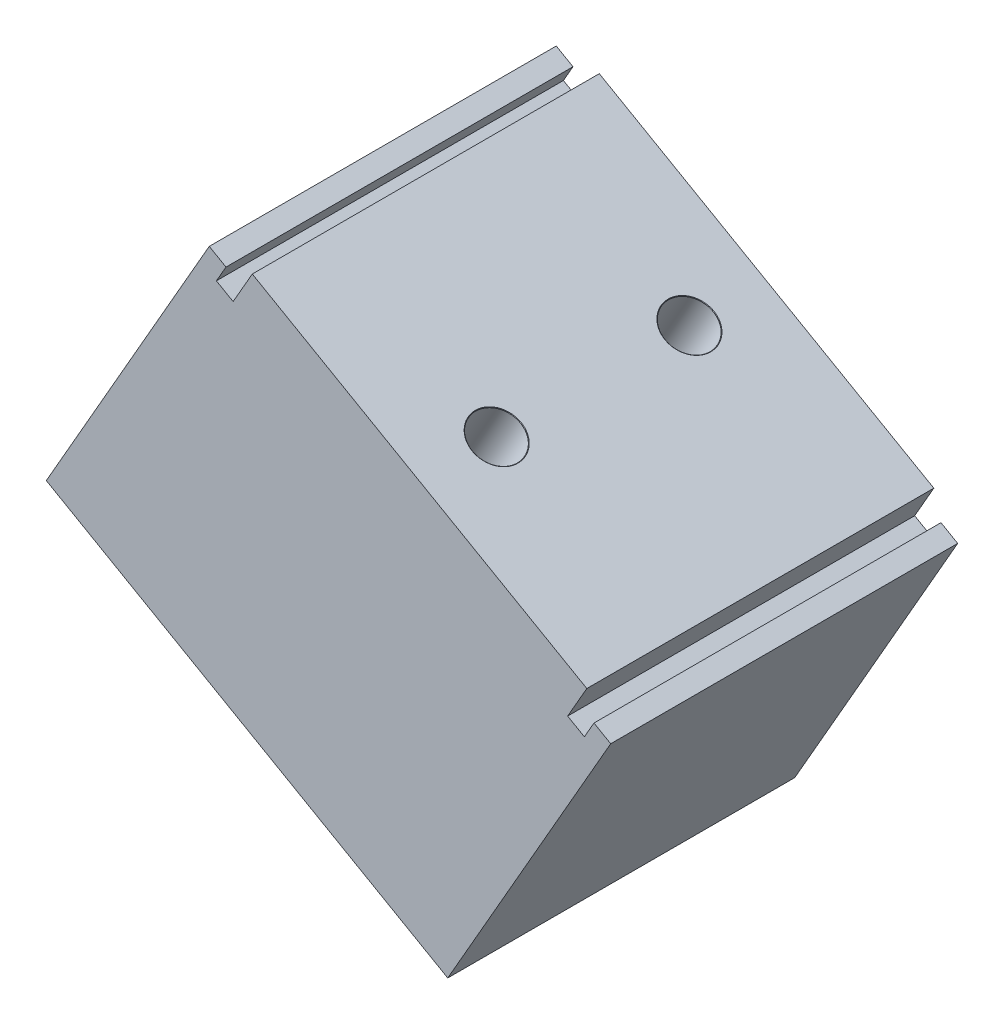
ISO-10303-21;
HEADER;
FILE_DESCRIPTION(('STEP AP214'),'2;1');
FILE_NAME('part.step','',(''),(''),'','','');
FILE_SCHEMA(('AUTOMOTIVE_DESIGN { 1 0 10303 214 1 1 1 1 }'));
ENDSEC;
DATA;
#1=APPLICATION_CONTEXT('core data for automotive mechanical design processes');
#2=APPLICATION_PROTOCOL_DEFINITION('international standard','automotive_design',2000,#1);
#3=PRODUCT_CONTEXT('',#1,'mechanical');
#4=PRODUCT('Part','Part','',(#3));
#5=PRODUCT_RELATED_PRODUCT_CATEGORY('part','',(#4));
#6=PRODUCT_DEFINITION_FORMATION('','',#4);
#7=PRODUCT_DEFINITION_CONTEXT('part definition',#1,'design');
#8=PRODUCT_DEFINITION('design','',#6,#7);
#9=PRODUCT_DEFINITION_SHAPE('','',#8);
#10=(LENGTH_UNIT() NAMED_UNIT(*) SI_UNIT(.MILLI.,.METRE.));
#11=(NAMED_UNIT(*) PLANE_ANGLE_UNIT() SI_UNIT($,.RADIAN.));
#12=(NAMED_UNIT(*) SI_UNIT($,.STERADIAN.) SOLID_ANGLE_UNIT());
#13=UNCERTAINTY_MEASURE_WITH_UNIT(LENGTH_MEASURE(1.E-05),#10,'distance_accuracy_value','');
#14=(GEOMETRIC_REPRESENTATION_CONTEXT(3) GLOBAL_UNCERTAINTY_ASSIGNED_CONTEXT((#13)) GLOBAL_UNIT_ASSIGNED_CONTEXT((#10,
#11,#12)) REPRESENTATION_CONTEXT('',''));
#15=CARTESIAN_POINT('',(0.,0.,0.));
#16=DIRECTION('',(0.,0.,1.));
#17=DIRECTION('',(1.,0.,0.));
#18=AXIS2_PLACEMENT_3D('',#15,#16,#17);
#19=CARTESIAN_POINT('',(50.8679611410851,-59.8679485135977,-9.));
#20=DIRECTION('',(0.497216671518887,0.867626406677251,0.));
#21=DIRECTION('',(-0.867626406677252,0.497216671518887,0.));
#22=AXIS2_PLACEMENT_3D('',#19,#20,#21);
#23=PLANE('',#22);
#24=CARTESIAN_POINT('',(59.5442252078576,-64.8401152287865,-5.));
#25=DIRECTION('',(0.497216671518887,0.867626406677251,0.));
#26=DIRECTION('',(-0.867626406677251,0.497216671518887,0.));
#27=AXIS2_PLACEMENT_3D('',#24,#25,#26);
#28=CIRCLE('',#27,1.275);
#29=CARTESIAN_POINT('',(58.4380015393441,-64.2061639726,-5.));
#30=VERTEX_POINT('',#29);
#31=EDGE_CURVE('E144',#30,#30,#28,.T.);
#32=ORIENTED_EDGE('',*,*,#31,.F.);
#33=EDGE_LOOP('',(#32));
#34=FACE_BOUND('',#33,.T.);
#35=CARTESIAN_POINT('',(59.5442252078576,-64.8401152287865,5.));
#36=DIRECTION('',(0.497216671518887,0.867626406677251,0.));
#37=DIRECTION('',(-0.867626406677251,0.497216671518887,0.));
#38=AXIS2_PLACEMENT_3D('',#35,#36,#37);
#39=CIRCLE('',#38,1.275);
#40=CARTESIAN_POINT('',(58.4380015393441,-64.2061639726,5.));
#41=VERTEX_POINT('',#40);
#42=EDGE_CURVE('E137',#41,#41,#39,.T.);
#43=ORIENTED_EDGE('',*,*,#42,.F.);
#44=EDGE_LOOP('',(#43));
#45=FACE_BOUND('',#44,.T.);
#46=DIRECTION('',(0.,0.,1.));
#47=VECTOR('',#46,1.);
#48=CARTESIAN_POINT('',(50.8679611410851,-59.8679485135977,-9.));
#49=LINE('',#48,#47);
#50=CARTESIAN_POINT('',(50.8679611410851,-59.8679485135977,-9.));
#51=VERTEX_POINT('',#50);
#52=CARTESIAN_POINT('',(50.8679611410851,-59.8679485135977,9.));
#53=VERTEX_POINT('',#52);
#54=EDGE_CURVE('E37',#51,#53,#49,.T.);
#55=ORIENTED_EDGE('',*,*,#54,.T.);
#56=DIRECTION('',(-0.867626406677251,0.497216671518887,0.));
#57=VECTOR('',#56,1.);
#58=CARTESIAN_POINT('',(50.8679611410851,-59.8679485135977,9.));
#59=LINE('',#58,#57);
#60=CARTESIAN_POINT('',(68.2204892746301,-69.8122819439754,9.));
#61=VERTEX_POINT('',#60);
#62=EDGE_CURVE('E153',#61,#53,#59,.T.);
#63=ORIENTED_EDGE('',*,*,#62,.F.);
#64=DIRECTION('',(0.,0.,1.));
#65=VECTOR('',#64,1.);
#66=CARTESIAN_POINT('',(68.2204892746301,-69.8122819439754,-9.));
#67=LINE('',#66,#65);
#68=CARTESIAN_POINT('',(68.2204892746301,-69.8122819439754,-9.));
#69=VERTEX_POINT('',#68);
#70=EDGE_CURVE('E11',#69,#61,#67,.T.);
#71=ORIENTED_EDGE('',*,*,#70,.F.);
#72=DIRECTION('',(-0.867626406677251,0.497216671518887,0.));
#73=VECTOR('',#72,1.);
#74=CARTESIAN_POINT('',(50.8679611410851,-59.8679485135977,-9.));
#75=LINE('',#74,#73);
#76=EDGE_CURVE('E189',#69,#51,#75,.T.);
#77=ORIENTED_EDGE('',*,*,#76,.T.);
#78=EDGE_LOOP('',(#55,#63,#71,#77));
#79=FACE_BOUND('',#78,.T.);
#80=ADVANCED_FACE('F34',(#34,#45,#79),#23,.T.);
#81=CARTESIAN_POINT('',(68.2204892746301,-69.8122819439754,-9.));
#82=DIRECTION('',(0.867626406677254,-0.497216671518883,0.));
#83=DIRECTION('',(0.497216671518883,0.867626406677254,0.));
#84=AXIS2_PLACEMENT_3D('',#81,#82,#83);
#85=PLANE('',#84);
#86=ORIENTED_EDGE('',*,*,#70,.T.);
#87=DIRECTION('',(0.497216671518883,0.867626406677254,0.));
#88=VECTOR('',#87,1.);
#89=CARTESIAN_POINT('',(68.2204892746301,-69.8122819439754,9.));
#90=LINE('',#89,#88);
#91=CARTESIAN_POINT('',(67.2260559315923,-71.5475347573299,9.));
#92=VERTEX_POINT('',#91);
#93=EDGE_CURVE('E186',#92,#61,#90,.T.);
#94=ORIENTED_EDGE('',*,*,#93,.F.);
#95=DIRECTION('',(0.,0.,1.));
#96=VECTOR('',#95,1.);
#97=CARTESIAN_POINT('',(67.2260559315923,-71.5475347573299,-9.));
#98=LINE('',#97,#96);
#99=CARTESIAN_POINT('',(67.2260559315923,-71.5475347573299,-9.));
#100=VERTEX_POINT('',#99);
#101=EDGE_CURVE('E42',#100,#92,#98,.T.);
#102=ORIENTED_EDGE('',*,*,#101,.F.);
#103=DIRECTION('',(0.497216671518883,0.867626406677254,0.));
#104=VECTOR('',#103,1.);
#105=CARTESIAN_POINT('',(68.2204892746301,-69.8122819439754,-9.));
#106=LINE('',#105,#104);
#107=EDGE_CURVE('E220',#100,#69,#106,.T.);
#108=ORIENTED_EDGE('',*,*,#107,.T.);
#109=EDGE_LOOP('',(#86,#94,#102,#108));
#110=FACE_BOUND('',#109,.T.);
#111=ADVANCED_FACE('F247',(#110),#85,.T.);
#112=CARTESIAN_POINT('',(67.2260559315923,-71.5475347573299,-9.));
#113=DIRECTION('',(0.497216671518904,0.867626406677242,0.));
#114=DIRECTION('',(-0.867626406677242,0.497216671518904,0.));
#115=AXIS2_PLACEMENT_3D('',#112,#113,#114);
#116=PLANE('',#115);
#117=ORIENTED_EDGE('',*,*,#101,.T.);
#118=DIRECTION('',(-0.867626406677242,0.497216671518904,0.));
#119=VECTOR('',#118,1.);
#120=CARTESIAN_POINT('',(67.2260559315923,-71.5475347573299,9.));
#121=LINE('',#120,#119);
#122=CARTESIAN_POINT('',(68.0936823382696,-72.0447514288488,9.));
#123=VERTEX_POINT('',#122);
#124=EDGE_CURVE('E183',#123,#92,#121,.T.);
#125=ORIENTED_EDGE('',*,*,#124,.F.);
#126=DIRECTION('',(0.,0.,1.));
#127=VECTOR('',#126,1.);
#128=CARTESIAN_POINT('',(68.0936823382696,-72.0447514288488,-9.));
#129=LINE('',#128,#127);
#130=CARTESIAN_POINT('',(68.0936823382696,-72.0447514288488,-9.));
#131=VERTEX_POINT('',#130);
#132=EDGE_CURVE('E223',#131,#123,#129,.T.);
#133=ORIENTED_EDGE('',*,*,#132,.F.);
#134=DIRECTION('',(-0.867626406677242,0.497216671518904,0.));
#135=VECTOR('',#134,1.);
#136=CARTESIAN_POINT('',(67.2260559315923,-71.5475347573299,-9.));
#137=LINE('',#136,#135);
#138=EDGE_CURVE('E218',#131,#100,#137,.T.);
#139=ORIENTED_EDGE('',*,*,#138,.T.);
#140=EDGE_LOOP('',(#117,#125,#133,#139));
#141=FACE_BOUND('',#140,.T.);
#142=ADVANCED_FACE('F284',(#141),#116,.T.);
#143=CARTESIAN_POINT('',(68.0936823382696,-72.0447514288488,-9.));
#144=DIRECTION('',(-0.867626406677257,0.497216671518877,0.));
#145=DIRECTION('',(-0.497216671518877,-0.867626406677257,0.));
#146=AXIS2_PLACEMENT_3D('',#143,#144,#145);
#147=PLANE('',#146);
#148=ORIENTED_EDGE('',*,*,#132,.T.);
#149=DIRECTION('',(-0.497216671518877,-0.867626406677257,0.));
#150=VECTOR('',#149,1.);
#151=CARTESIAN_POINT('',(68.0936823382696,-72.0447514288488,9.));
#152=LINE('',#151,#150);
#153=CARTESIAN_POINT('',(68.5908990097884,-71.1771250221715,9.));
#154=VERTEX_POINT('',#153);
#155=EDGE_CURVE('E180',#154,#123,#152,.T.);
#156=ORIENTED_EDGE('',*,*,#155,.F.);
#157=DIRECTION('',(0.,0.,1.));
#158=VECTOR('',#157,1.);
#159=CARTESIAN_POINT('',(68.5908990097884,-71.1771250221715,-9.));
#160=LINE('',#159,#158);
#161=CARTESIAN_POINT('',(68.5908990097884,-71.1771250221715,-9.));
#162=VERTEX_POINT('',#161);
#163=EDGE_CURVE('E225',#162,#154,#160,.T.);
#164=ORIENTED_EDGE('',*,*,#163,.F.);
#165=DIRECTION('',(-0.497216671518877,-0.867626406677257,0.));
#166=VECTOR('',#165,1.);
#167=CARTESIAN_POINT('',(68.0936823382696,-72.0447514288488,-9.));
#168=LINE('',#167,#166);
#169=EDGE_CURVE('E215',#162,#131,#168,.T.);
#170=ORIENTED_EDGE('',*,*,#169,.T.);
#171=EDGE_LOOP('',(#148,#156,#164,#170));
#172=FACE_BOUND('',#171,.T.);
#173=ADVANCED_FACE('F282',(#172),#147,.T.);
#174=CARTESIAN_POINT('',(68.5908990097884,-71.1771250221715,-9.));
#175=DIRECTION('',(0.497216671518887,0.867626406677251,0.));
#176=DIRECTION('',(-0.867626406677251,0.497216671518887,0.));
#177=AXIS2_PLACEMENT_3D('',#174,#175,#176);
#178=PLANE('',#177);
#179=ORIENTED_EDGE('',*,*,#163,.T.);
#180=DIRECTION('',(-0.867626406677251,0.497216671518887,0.));
#181=VECTOR('',#180,1.);
#182=CARTESIAN_POINT('',(68.5908990097884,-71.1771250221715,9.));
#183=LINE('',#182,#181);
#184=CARTESIAN_POINT('',(69.4585254164657,-71.6743416936904,9.));
#185=VERTEX_POINT('',#184);
#186=EDGE_CURVE('E177',#185,#154,#183,.T.);
#187=ORIENTED_EDGE('',*,*,#186,.F.);
#188=DIRECTION('',(0.,0.,1.));
#189=VECTOR('',#188,1.);
#190=CARTESIAN_POINT('',(69.4585254164657,-71.6743416936904,-9.));
#191=LINE('',#190,#189);
#192=CARTESIAN_POINT('',(69.4585254164657,-71.6743416936904,-9.));
#193=VERTEX_POINT('',#192);
#194=EDGE_CURVE('E227',#193,#185,#191,.T.);
#195=ORIENTED_EDGE('',*,*,#194,.F.);
#196=DIRECTION('',(-0.867626406677251,0.497216671518887,0.));
#197=VECTOR('',#196,1.);
#198=CARTESIAN_POINT('',(68.5908990097884,-71.1771250221715,-9.));
#199=LINE('',#198,#197);
#200=EDGE_CURVE('E212',#193,#162,#199,.T.);
#201=ORIENTED_EDGE('',*,*,#200,.T.);
#202=EDGE_LOOP('',(#179,#187,#195,#201));
#203=FACE_BOUND('',#202,.T.);
#204=ADVANCED_FACE('F278',(#203),#178,.T.);
#205=CARTESIAN_POINT('',(69.4585254164657,-71.6743416936904,-9.));
#206=DIRECTION('',(0.867626406677251,-0.497216671518888,0.));
#207=DIRECTION('',(0.497216671518888,0.867626406677251,0.));
#208=AXIS2_PLACEMENT_3D('',#205,#206,#207);
#209=PLANE('',#208);
#210=ORIENTED_EDGE('',*,*,#194,.T.);
#211=DIRECTION('',(0.497216671518888,0.867626406677251,0.));
#212=VECTOR('',#211,1.);
#213=CARTESIAN_POINT('',(69.4585254164657,-71.6743416936904,9.));
#214=LINE('',#213,#212);
#215=CARTESIAN_POINT('',(61.0058420006446,-86.4239906072037,9.));
#216=VERTEX_POINT('',#215);
#217=EDGE_CURVE('E174',#216,#185,#214,.T.);
#218=ORIENTED_EDGE('',*,*,#217,.F.);
#219=DIRECTION('',(0.,0.,1.));
#220=VECTOR('',#219,1.);
#221=CARTESIAN_POINT('',(61.0058420006446,-86.4239906072037,-9.));
#222=LINE('',#221,#220);
#223=CARTESIAN_POINT('',(61.0058420006446,-86.4239906072037,-9.));
#224=VERTEX_POINT('',#223);
#225=EDGE_CURVE('E229',#224,#216,#222,.T.);
#226=ORIENTED_EDGE('',*,*,#225,.F.);
#227=DIRECTION('',(0.497216671518888,0.867626406677251,0.));
#228=VECTOR('',#227,1.);
#229=CARTESIAN_POINT('',(69.4585254164657,-71.6743416936904,-9.));
#230=LINE('',#229,#228);
#231=EDGE_CURVE('E209',#224,#193,#230,.T.);
#232=ORIENTED_EDGE('',*,*,#231,.T.);
#233=EDGE_LOOP('',(#210,#218,#226,#232));
#234=FACE_BOUND('',#233,.T.);
#235=ADVANCED_FACE('F275',(#234),#209,.T.);
#236=CARTESIAN_POINT('',(40.1828082403906,-74.4907904907504,-9.));
#237=DIRECTION('',(-0.497216671518887,-0.867626406677251,0.));
#238=DIRECTION('',(0.867626406677251,-0.497216671518887,0.));
#239=AXIS2_PLACEMENT_3D('',#236,#237,#238);
#240=PLANE('',#239);
#241=ORIENTED_EDGE('',*,*,#225,.T.);
#242=DIRECTION('',(0.867626406677251,-0.497216671518887,0.));
#243=VECTOR('',#242,1.);
#244=CARTESIAN_POINT('',(40.1828082403906,-74.4907904907504,9.));
#245=LINE('',#244,#243);
#246=CARTESIAN_POINT('',(40.1828082403906,-74.4907904907504,9.));
#247=VERTEX_POINT('',#246);
#248=EDGE_CURVE('E171',#247,#216,#245,.T.);
#249=ORIENTED_EDGE('',*,*,#248,.F.);
#250=DIRECTION('',(0.,0.,1.));
#251=VECTOR('',#250,1.);
#252=CARTESIAN_POINT('',(40.1828082403906,-74.4907904907504,-9.));
#253=LINE('',#252,#251);
#254=CARTESIAN_POINT('',(40.1828082403906,-74.4907904907504,-9.));
#255=VERTEX_POINT('',#254);
#256=EDGE_CURVE('E231',#255,#247,#253,.T.);
#257=ORIENTED_EDGE('',*,*,#256,.F.);
#258=DIRECTION('',(0.867626406677251,-0.497216671518887,0.));
#259=VECTOR('',#258,1.);
#260=CARTESIAN_POINT('',(40.1828082403906,-74.4907904907504,-9.));
#261=LINE('',#260,#259);
#262=EDGE_CURVE('E206',#255,#224,#261,.T.);
#263=ORIENTED_EDGE('',*,*,#262,.T.);
#264=EDGE_LOOP('',(#241,#249,#257,#263));
#265=FACE_BOUND('',#264,.T.);
#266=ADVANCED_FACE('F273',(#265),#240,.T.);
#267=CARTESIAN_POINT('',(48.6354916562117,-59.7411415772371,-9.));
#268=DIRECTION('',(-0.867626406677252,0.497216671518886,0.));
#269=DIRECTION('',(-0.497216671518886,-0.867626406677252,0.));
#270=AXIS2_PLACEMENT_3D('',#267,#268,#269);
#271=PLANE('',#270);
#272=ORIENTED_EDGE('',*,*,#256,.T.);
#273=DIRECTION('',(-0.497216671518886,-0.867626406677252,0.));
#274=VECTOR('',#273,1.);
#275=CARTESIAN_POINT('',(48.6354916562117,-59.7411415772371,9.));
#276=LINE('',#275,#274);
#277=CARTESIAN_POINT('',(48.6354916562117,-59.7411415772371,9.));
#278=VERTEX_POINT('',#277);
#279=EDGE_CURVE('E168',#278,#247,#276,.T.);
#280=ORIENTED_EDGE('',*,*,#279,.F.);
#281=DIRECTION('',(0.,0.,1.));
#282=VECTOR('',#281,1.);
#283=CARTESIAN_POINT('',(48.6354916562117,-59.7411415772371,-9.));
#284=LINE('',#283,#282);
#285=CARTESIAN_POINT('',(48.6354916562117,-59.7411415772371,-9.));
#286=VERTEX_POINT('',#285);
#287=EDGE_CURVE('E233',#286,#278,#284,.T.);
#288=ORIENTED_EDGE('',*,*,#287,.F.);
#289=DIRECTION('',(-0.497216671518886,-0.867626406677252,0.));
#290=VECTOR('',#289,1.);
#291=CARTESIAN_POINT('',(48.6354916562117,-59.7411415772371,-9.));
#292=LINE('',#291,#290);
#293=EDGE_CURVE('E203',#286,#255,#292,.T.);
#294=ORIENTED_EDGE('',*,*,#293,.T.);
#295=EDGE_LOOP('',(#272,#280,#288,#294));
#296=FACE_BOUND('',#295,.T.);
#297=ADVANCED_FACE('F268',(#296),#271,.T.);
#298=CARTESIAN_POINT('',(49.5031180628889,-60.238358248756,-9.));
#299=DIRECTION('',(0.497216671518887,0.867626406677251,0.));
#300=DIRECTION('',(-0.867626406677251,0.497216671518887,0.));
#301=AXIS2_PLACEMENT_3D('',#298,#299,#300);
#302=PLANE('',#301);
#303=ORIENTED_EDGE('',*,*,#287,.T.);
#304=DIRECTION('',(-0.867626406677251,0.497216671518887,0.));
#305=VECTOR('',#304,1.);
#306=CARTESIAN_POINT('',(49.5031180628889,-60.238358248756,9.));
#307=LINE('',#306,#305);
#308=CARTESIAN_POINT('',(49.5031180628889,-60.238358248756,9.));
#309=VERTEX_POINT('',#308);
#310=EDGE_CURVE('E165',#309,#278,#307,.T.);
#311=ORIENTED_EDGE('',*,*,#310,.F.);
#312=DIRECTION('',(0.,0.,1.));
#313=VECTOR('',#312,1.);
#314=CARTESIAN_POINT('',(49.5031180628889,-60.238358248756,-9.));
#315=LINE('',#314,#313);
#316=CARTESIAN_POINT('',(49.5031180628889,-60.238358248756,-9.));
#317=VERTEX_POINT('',#316);
#318=EDGE_CURVE('E235',#317,#309,#315,.T.);
#319=ORIENTED_EDGE('',*,*,#318,.F.);
#320=DIRECTION('',(-0.867626406677251,0.497216671518887,0.));
#321=VECTOR('',#320,1.);
#322=CARTESIAN_POINT('',(49.5031180628889,-60.238358248756,-9.));
#323=LINE('',#322,#321);
#324=EDGE_CURVE('E200',#317,#286,#323,.T.);
#325=ORIENTED_EDGE('',*,*,#324,.T.);
#326=EDGE_LOOP('',(#303,#311,#319,#325));
#327=FACE_BOUND('',#326,.T.);
#328=ADVANCED_FACE('F263',(#327),#302,.T.);
#329=CARTESIAN_POINT('',(49.00590139137,-61.1059846554333,-9.));
#330=DIRECTION('',(0.867626406677248,-0.497216671518893,0.));
#331=DIRECTION('',(0.497216671518893,0.867626406677248,0.));
#332=AXIS2_PLACEMENT_3D('',#329,#330,#331);
#333=PLANE('',#332);
#334=ORIENTED_EDGE('',*,*,#318,.T.);
#335=DIRECTION('',(0.497216671518893,0.867626406677248,0.));
#336=VECTOR('',#335,1.);
#337=CARTESIAN_POINT('',(49.00590139137,-61.1059846554333,9.));
#338=LINE('',#337,#336);
#339=CARTESIAN_POINT('',(49.00590139137,-61.1059846554333,9.));
#340=VERTEX_POINT('',#339);
#341=EDGE_CURVE('E162',#340,#309,#338,.T.);
#342=ORIENTED_EDGE('',*,*,#341,.F.);
#343=DIRECTION('',(0.,0.,1.));
#344=VECTOR('',#343,1.);
#345=CARTESIAN_POINT('',(49.00590139137,-61.1059846554333,-9.));
#346=LINE('',#345,#344);
#347=CARTESIAN_POINT('',(49.00590139137,-61.1059846554333,-9.));
#348=VERTEX_POINT('',#347);
#349=EDGE_CURVE('E237',#348,#340,#346,.T.);
#350=ORIENTED_EDGE('',*,*,#349,.F.);
#351=DIRECTION('',(0.497216671518893,0.867626406677248,0.));
#352=VECTOR('',#351,1.);
#353=CARTESIAN_POINT('',(49.00590139137,-61.1059846554333,-9.));
#354=LINE('',#353,#352);
#355=EDGE_CURVE('E197',#348,#317,#354,.T.);
#356=ORIENTED_EDGE('',*,*,#355,.T.);
#357=EDGE_LOOP('',(#334,#342,#350,#356));
#358=FACE_BOUND('',#357,.T.);
#359=ADVANCED_FACE('F261',(#358),#333,.T.);
#360=CARTESIAN_POINT('',(49.8735277980473,-61.6032013269521,-9.));
#361=DIRECTION('',(0.497216671518885,0.867626406677252,0.));
#362=DIRECTION('',(-0.867626406677253,0.497216671518885,0.));
#363=AXIS2_PLACEMENT_3D('',#360,#361,#362);
#364=PLANE('',#363);
#365=ORIENTED_EDGE('',*,*,#349,.T.);
#366=DIRECTION('',(-0.867626406677253,0.497216671518885,0.));
#367=VECTOR('',#366,1.);
#368=CARTESIAN_POINT('',(49.8735277980473,-61.6032013269521,9.));
#369=LINE('',#368,#367);
#370=CARTESIAN_POINT('',(49.8735277980473,-61.6032013269521,9.));
#371=VERTEX_POINT('',#370);
#372=EDGE_CURVE('E159',#371,#340,#369,.T.);
#373=ORIENTED_EDGE('',*,*,#372,.F.);
#374=DIRECTION('',(0.,0.,1.));
#375=VECTOR('',#374,1.);
#376=CARTESIAN_POINT('',(49.8735277980473,-61.6032013269521,-9.));
#377=LINE('',#376,#375);
#378=CARTESIAN_POINT('',(49.8735277980473,-61.6032013269521,-9.));
#379=VERTEX_POINT('',#378);
#380=EDGE_CURVE('E238',#379,#371,#377,.T.);
#381=ORIENTED_EDGE('',*,*,#380,.F.);
#382=DIRECTION('',(-0.867626406677253,0.497216671518885,0.));
#383=VECTOR('',#382,1.);
#384=CARTESIAN_POINT('',(49.8735277980473,-61.6032013269521,-9.));
#385=LINE('',#384,#383);
#386=EDGE_CURVE('E194',#379,#348,#385,.T.);
#387=ORIENTED_EDGE('',*,*,#386,.T.);
#388=EDGE_LOOP('',(#365,#373,#381,#387));
#389=FACE_BOUND('',#388,.T.);
#390=ADVANCED_FACE('F257',(#389),#364,.T.);
#391=CARTESIAN_POINT('',(50.8679611410851,-59.8679485135977,-9.));
#392=DIRECTION('',(-0.867626406677248,0.497216671518893,0.));
#393=DIRECTION('',(-0.497216671518893,-0.867626406677248,0.));
#394=AXIS2_PLACEMENT_3D('',#391,#392,#393);
#395=PLANE('',#394);
#396=ORIENTED_EDGE('',*,*,#380,.T.);
#397=DIRECTION('',(-0.497216671518893,-0.867626406677248,0.));
#398=VECTOR('',#397,1.);
#399=CARTESIAN_POINT('',(50.8679611410851,-59.8679485135977,9.));
#400=LINE('',#399,#398);
#401=EDGE_CURVE('E156',#53,#371,#400,.T.);
#402=ORIENTED_EDGE('',*,*,#401,.F.);
#403=ORIENTED_EDGE('',*,*,#54,.F.);
#404=DIRECTION('',(-0.497216671518893,-0.867626406677248,0.));
#405=VECTOR('',#404,1.);
#406=CARTESIAN_POINT('',(50.8679611410851,-59.8679485135977,-9.));
#407=LINE('',#406,#405);
#408=EDGE_CURVE('E191',#51,#379,#407,.T.);
#409=ORIENTED_EDGE('',*,*,#408,.T.);
#410=EDGE_LOOP('',(#396,#402,#403,#409));
#411=FACE_BOUND('',#410,.T.);
#412=ADVANCED_FACE('F242',(#411),#395,.T.);
#413=CARTESIAN_POINT('',(0.,0.,-9.));
#414=DIRECTION('',(0.,0.,-1.));
#415=DIRECTION('',(-1.,0.,0.));
#416=AXIS2_PLACEMENT_3D('',#413,#414,#415);
#417=PLANE('',#416);
#418=ORIENTED_EDGE('',*,*,#76,.F.);
#419=ORIENTED_EDGE('',*,*,#107,.F.);
#420=ORIENTED_EDGE('',*,*,#138,.F.);
#421=ORIENTED_EDGE('',*,*,#169,.F.);
#422=ORIENTED_EDGE('',*,*,#200,.F.);
#423=ORIENTED_EDGE('',*,*,#231,.F.);
#424=ORIENTED_EDGE('',*,*,#262,.F.);
#425=ORIENTED_EDGE('',*,*,#293,.F.);
#426=ORIENTED_EDGE('',*,*,#324,.F.);
#427=ORIENTED_EDGE('',*,*,#355,.F.);
#428=ORIENTED_EDGE('',*,*,#386,.F.);
#429=ORIENTED_EDGE('',*,*,#408,.F.);
#430=EDGE_LOOP('',(#418,#419,#420,#421,#422,#423,#424,#425,#426,#427,#428,#429));
#431=FACE_BOUND('',#430,.T.);
#432=ADVANCED_FACE('F251',(#431),#417,.T.);
#433=CARTESIAN_POINT('',(0.,0.,9.));
#434=DIRECTION('',(0.,0.,-1.));
#435=DIRECTION('',(-1.,0.,0.));
#436=AXIS2_PLACEMENT_3D('',#433,#434,#435);
#437=PLANE('',#436);
#438=ORIENTED_EDGE('',*,*,#62,.T.);
#439=ORIENTED_EDGE('',*,*,#401,.T.);
#440=ORIENTED_EDGE('',*,*,#372,.T.);
#441=ORIENTED_EDGE('',*,*,#341,.T.);
#442=ORIENTED_EDGE('',*,*,#310,.T.);
#443=ORIENTED_EDGE('',*,*,#279,.T.);
#444=ORIENTED_EDGE('',*,*,#248,.T.);
#445=ORIENTED_EDGE('',*,*,#217,.T.);
#446=ORIENTED_EDGE('',*,*,#186,.T.);
#447=ORIENTED_EDGE('',*,*,#155,.T.);
#448=ORIENTED_EDGE('',*,*,#124,.T.);
#449=ORIENTED_EDGE('',*,*,#93,.T.);
#450=EDGE_LOOP('',(#438,#439,#440,#441,#442,#443,#444,#445,#446,#447,#448,#449));
#451=FACE_BOUND('',#450,.T.);
#452=ADVANCED_FACE('F245',(#451),#437,.F.);
#453=CARTESIAN_POINT('',(57.555358521782,-68.3106208554956,5.));
#454=DIRECTION('',(0.497216671518887,0.867626406677251,0.));
#455=DIRECTION('',(-0.867626406677251,0.497216671518887,0.));
#456=AXIS2_PLACEMENT_3D('',#453,#454,#455);
#457=CONICAL_SURFACE('',#456,1.25,1.02974425867665);
#458=CARTESIAN_POINT('',(57.1819111254824,-68.9622740302465,5.));
#459=VERTEX_POINT('',#458);
#460=VERTEX_LOOP('',#459);
#461=FACE_BOUND('',#460,.T.);
#462=CARTESIAN_POINT('',(57.555358521782,-68.3106208554956,5.));
#463=DIRECTION('',(0.497216671518887,0.867626406677251,0.));
#464=DIRECTION('',(-0.867626406677251,0.497216671518887,0.));
#465=AXIS2_PLACEMENT_3D('',#462,#463,#464);
#466=CIRCLE('',#465,1.25);
#467=CARTESIAN_POINT('',(56.4708255134355,-67.6891000160969,5.));
#468=VERTEX_POINT('',#467);
#469=EDGE_CURVE('E150',#468,#468,#466,.T.);
#470=ORIENTED_EDGE('',*,*,#469,.T.);
#471=EDGE_LOOP('',(#470));
#472=FACE_BOUND('',#471,.T.);
#473=ADVANCED_FACE('F311',(#461,#472),#457,.F.);
#474=CARTESIAN_POINT('',(59.5442252078576,-64.8401152287865,5.));
#475=DIRECTION('',(0.497216671518887,0.867626406677251,0.));
#476=DIRECTION('',(-0.867626406677251,0.497216671518887,0.));
#477=AXIS2_PLACEMENT_3D('',#474,#475,#476);
#478=CYLINDRICAL_SURFACE('',#477,1.25);
#479=ORIENTED_EDGE('',*,*,#469,.F.);
#480=EDGE_LOOP('',(#479));
#481=FACE_BOUND('',#480,.T.);
#482=CARTESIAN_POINT('',(59.5317947910696,-64.8618058889535,5.));
#483=DIRECTION('',(0.497216671518887,0.867626406677251,0.));
#484=DIRECTION('',(-0.867626406677251,0.497216671518887,0.));
#485=AXIS2_PLACEMENT_3D('',#482,#483,#484);
#486=CIRCLE('',#485,1.25);
#487=CARTESIAN_POINT('',(58.447261782723,-64.2402850495549,5.));
#488=VERTEX_POINT('',#487);
#489=EDGE_CURVE('E141',#488,#488,#486,.T.);
#490=ORIENTED_EDGE('',*,*,#489,.T.);
#491=EDGE_LOOP('',(#490));
#492=FACE_BOUND('',#491,.T.);
#493=ADVANCED_FACE('F305',(#481,#492),#478,.F.);
#494=CARTESIAN_POINT('',(59.5442252078576,-64.8401152287865,5.));
#495=DIRECTION('',(0.497216671518887,0.867626406677251,0.));
#496=DIRECTION('',(-0.867626406677251,0.497216671518887,0.));
#497=AXIS2_PLACEMENT_3D('',#494,#495,#496);
#498=CONICAL_SURFACE('',#497,1.275,0.785398163397548);
#499=ORIENTED_EDGE('',*,*,#489,.F.);
#500=EDGE_LOOP('',(#499));
#501=FACE_BOUND('',#500,.T.);
#502=ORIENTED_EDGE('',*,*,#42,.T.);
#503=EDGE_LOOP('',(#502));
#504=FACE_BOUND('',#503,.T.);
#505=ADVANCED_FACE('F131',(#501,#504),#498,.F.);
#506=CARTESIAN_POINT('',(57.555358521782,-68.3106208554956,-5.));
#507=DIRECTION('',(0.497216671518887,0.867626406677251,0.));
#508=DIRECTION('',(-0.867626406677251,0.497216671518887,0.));
#509=AXIS2_PLACEMENT_3D('',#506,#507,#508);
#510=CONICAL_SURFACE('',#509,1.25,1.02974425867665);
#511=CARTESIAN_POINT('',(57.1819111254824,-68.9622740302465,-5.));
#512=VERTEX_POINT('',#511);
#513=VERTEX_LOOP('',#512);
#514=FACE_BOUND('',#513,.T.);
#515=CARTESIAN_POINT('',(57.555358521782,-68.3106208554956,-5.));
#516=DIRECTION('',(0.497216671518887,0.867626406677251,0.));
#517=DIRECTION('',(-0.867626406677251,0.497216671518887,0.));
#518=AXIS2_PLACEMENT_3D('',#515,#516,#517);
#519=CIRCLE('',#518,1.25);
#520=CARTESIAN_POINT('',(56.4708255134355,-67.6891000160969,-5.));
#521=VERTEX_POINT('',#520);
#522=EDGE_CURVE('E135',#521,#521,#519,.T.);
#523=ORIENTED_EDGE('',*,*,#522,.T.);
#524=EDGE_LOOP('',(#523));
#525=FACE_BOUND('',#524,.T.);
#526=ADVANCED_FACE('F127',(#514,#525),#510,.F.);
#527=CARTESIAN_POINT('',(59.5442252078576,-64.8401152287865,-5.));
#528=DIRECTION('',(0.497216671518887,0.867626406677251,0.));
#529=DIRECTION('',(-0.867626406677251,0.497216671518887,0.));
#530=AXIS2_PLACEMENT_3D('',#527,#528,#529);
#531=CYLINDRICAL_SURFACE('',#530,1.25);
#532=ORIENTED_EDGE('',*,*,#522,.F.);
#533=EDGE_LOOP('',(#532));
#534=FACE_BOUND('',#533,.T.);
#535=CARTESIAN_POINT('',(59.5317947910696,-64.8618058889535,-5.));
#536=DIRECTION('',(0.497216671518887,0.867626406677251,0.));
#537=DIRECTION('',(-0.867626406677251,0.497216671518887,0.));
#538=AXIS2_PLACEMENT_3D('',#535,#536,#537);
#539=CIRCLE('',#538,1.25);
#540=CARTESIAN_POINT('',(58.447261782723,-64.2402850495549,-5.));
#541=VERTEX_POINT('',#540);
#542=EDGE_CURVE('E138',#541,#541,#539,.T.);
#543=ORIENTED_EDGE('',*,*,#542,.T.);
#544=EDGE_LOOP('',(#543));
#545=FACE_BOUND('',#544,.T.);
#546=ADVANCED_FACE('F130',(#534,#545),#531,.F.);
#547=CARTESIAN_POINT('',(59.5442252078576,-64.8401152287865,-5.));
#548=DIRECTION('',(0.497216671518887,0.867626406677251,0.));
#549=DIRECTION('',(-0.867626406677251,0.497216671518887,0.));
#550=AXIS2_PLACEMENT_3D('',#547,#548,#549);
#551=CONICAL_SURFACE('',#550,1.275,0.785398163397548);
#552=ORIENTED_EDGE('',*,*,#542,.F.);
#553=EDGE_LOOP('',(#552));
#554=FACE_BOUND('',#553,.T.);
#555=ORIENTED_EDGE('',*,*,#31,.T.);
#556=EDGE_LOOP('',(#555));
#557=FACE_BOUND('',#556,.T.);
#558=ADVANCED_FACE('F411',(#554,#557),#551,.F.);
#559=CLOSED_SHELL('',(#80,#111,#142,#173,#204,#235,#266,#297,#328,#359,#390,#412,#432,#452,#473,
#493,#505,#526,#546,#558));
#560=MANIFOLD_SOLID_BREP('B2',#559);
#561=ADVANCED_BREP_SHAPE_REPRESENTATION('',(#18,#560),#14);
#562=SHAPE_DEFINITION_REPRESENTATION(#9,#561);
ENDSEC;
END-ISO-10303-21;
